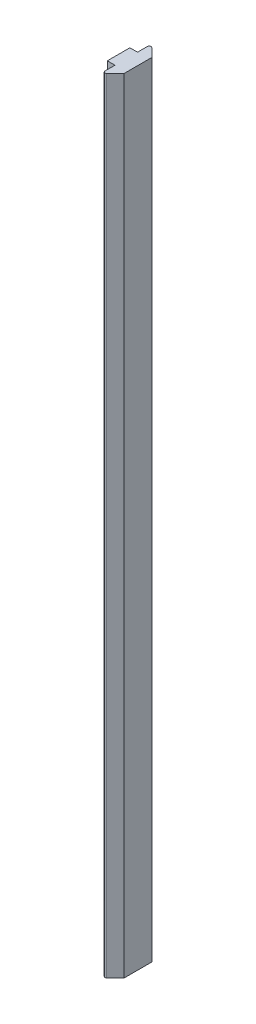
ISO-10303-21;
HEADER;
FILE_DESCRIPTION(('STEP AP214'),'2;1');
FILE_NAME('part.step','',(''),(''),'','','');
FILE_SCHEMA(('AUTOMOTIVE_DESIGN { 1 0 10303 214 1 1 1 1 }'));
ENDSEC;
DATA;
#1=APPLICATION_CONTEXT('core data for automotive mechanical design processes');
#2=APPLICATION_PROTOCOL_DEFINITION('international standard','automotive_design',2000,#1);
#3=PRODUCT_CONTEXT('',#1,'mechanical');
#4=PRODUCT('Part','Part','',(#3));
#5=PRODUCT_RELATED_PRODUCT_CATEGORY('part','',(#4));
#6=PRODUCT_DEFINITION_FORMATION('','',#4);
#7=PRODUCT_DEFINITION_CONTEXT('part definition',#1,'design');
#8=PRODUCT_DEFINITION('design','',#6,#7);
#9=PRODUCT_DEFINITION_SHAPE('','',#8);
#10=(LENGTH_UNIT() NAMED_UNIT(*) SI_UNIT(.MILLI.,.METRE.));
#11=(NAMED_UNIT(*) PLANE_ANGLE_UNIT() SI_UNIT($,.RADIAN.));
#12=(NAMED_UNIT(*) SI_UNIT($,.STERADIAN.) SOLID_ANGLE_UNIT());
#13=UNCERTAINTY_MEASURE_WITH_UNIT(LENGTH_MEASURE(1.E-05),#10,'distance_accuracy_value','');
#14=(GEOMETRIC_REPRESENTATION_CONTEXT(3) GLOBAL_UNCERTAINTY_ASSIGNED_CONTEXT((#13)) GLOBAL_UNIT_ASSIGNED_CONTEXT((#10,
#11,#12)) REPRESENTATION_CONTEXT('',''));
#15=CARTESIAN_POINT('',(0.,0.,0.));
#16=DIRECTION('',(0.,0.,1.));
#17=DIRECTION('',(1.,0.,0.));
#18=AXIS2_PLACEMENT_3D('',#15,#16,#17);
#19=CARTESIAN_POINT('',(-3.23933986621706,200.,2.87805090450655));
#20=DIRECTION('',(0.,0.,-1.));
#21=DIRECTION('',(-1.,0.,0.));
#22=AXIS2_PLACEMENT_3D('',#19,#20,#21);
#23=PLANE('',#22);
#24=DIRECTION('',(1.,0.,0.));
#25=VECTOR('',#24,1.);
#26=CARTESIAN_POINT('',(-3.23933986621706,0.,2.87805090450655));
#27=LINE('',#26,#25);
#28=CARTESIAN_POINT('',(-5.18933983831155,0.,2.87805090450655));
#29=VERTEX_POINT('',#28);
#30=CARTESIAN_POINT('',(-3.23933986621706,0.,2.87805090450655));
#31=VERTEX_POINT('',#30);
#32=EDGE_CURVE('E150',#29,#31,#27,.T.);
#33=ORIENTED_EDGE('',*,*,#32,.T.);
#34=DIRECTION('',(0.,-1.,0.));
#35=VECTOR('',#34,1.);
#36=CARTESIAN_POINT('',(-3.23933986621706,200.,2.87805090450655));
#37=LINE('',#36,#35);
#38=CARTESIAN_POINT('',(-3.23933986621706,200.,2.87805090450655));
#39=VERTEX_POINT('',#38);
#40=EDGE_CURVE('E11',#39,#31,#37,.T.);
#41=ORIENTED_EDGE('',*,*,#40,.F.);
#42=DIRECTION('',(1.,0.,0.));
#43=VECTOR('',#42,1.);
#44=CARTESIAN_POINT('',(-3.23933986621706,200.,2.87805090450655));
#45=LINE('',#44,#43);
#46=CARTESIAN_POINT('',(-5.18933983831155,200.,2.87805090450655));
#47=VERTEX_POINT('',#46);
#48=EDGE_CURVE('E164',#47,#39,#45,.T.);
#49=ORIENTED_EDGE('',*,*,#48,.F.);
#50=DIRECTION('',(0.,-1.,0.));
#51=VECTOR('',#50,1.);
#52=CARTESIAN_POINT('',(-5.18933983831155,200.,2.87805090450655));
#53=LINE('',#52,#51);
#54=EDGE_CURVE('E142',#47,#29,#53,.T.);
#55=ORIENTED_EDGE('',*,*,#54,.T.);
#56=EDGE_LOOP('',(#33,#41,#49,#55));
#57=FACE_BOUND('',#56,.T.);
#58=ADVANCED_FACE('F39',(#57),#23,.F.);
#59=CARTESIAN_POINT('',(-3.23933986621706,200.,2.87805090450655));
#60=DIRECTION('',(1.,0.,0.));
#61=DIRECTION('',(0.,0.,-1.));
#62=AXIS2_PLACEMENT_3D('',#59,#60,#61);
#63=PLANE('',#62);
#64=DIRECTION('',(0.,0.,1.));
#65=VECTOR('',#64,1.);
#66=CARTESIAN_POINT('',(-3.23933986621706,0.,2.87805090450655));
#67=LINE('',#66,#65);
#68=CARTESIAN_POINT('',(-3.23933986621706,0.,5.42744122113594));
#69=VERTEX_POINT('',#68);
#70=EDGE_CURVE('E148',#31,#69,#67,.T.);
#71=ORIENTED_EDGE('',*,*,#70,.T.);
#72=DIRECTION('',(0.,-1.,0.));
#73=VECTOR('',#72,1.);
#74=CARTESIAN_POINT('',(-3.23933986621706,200.,5.42744122113594));
#75=LINE('',#74,#73);
#76=CARTESIAN_POINT('',(-3.23933986621706,200.,5.42744122113594));
#77=VERTEX_POINT('',#76);
#78=EDGE_CURVE('E50',#77,#69,#75,.T.);
#79=ORIENTED_EDGE('',*,*,#78,.F.);
#80=DIRECTION('',(0.,0.,1.));
#81=VECTOR('',#80,1.);
#82=CARTESIAN_POINT('',(-3.23933986621706,200.,2.87805090450655));
#83=LINE('',#82,#81);
#84=EDGE_CURVE('E104',#39,#77,#83,.T.);
#85=ORIENTED_EDGE('',*,*,#84,.F.);
#86=ORIENTED_EDGE('',*,*,#40,.T.);
#87=EDGE_LOOP('',(#71,#79,#85,#86));
#88=FACE_BOUND('',#87,.T.);
#89=ADVANCED_FACE('F215',(#88),#63,.F.);
#90=CARTESIAN_POINT('',(-2.78933986621717,200.,5.42744122113487));
#91=DIRECTION('',(0.,-1.,0.));
#92=DIRECTION('',(0.,0.,-1.));
#93=AXIS2_PLACEMENT_3D('',#90,#91,#92);
#94=CYLINDRICAL_SURFACE('',#93,0.449999999999945);
#95=CARTESIAN_POINT('',(-2.78933986621717,0.,5.42744122113487));
#96=DIRECTION('',(0.,1.,0.));
#97=DIRECTION('',(0.,0.,1.));
#98=AXIS2_PLACEMENT_3D('',#95,#96,#97);
#99=CIRCLE('',#98,0.449999999999945);
#100=CARTESIAN_POINT('',(-2.47114181468326,0.,5.74563927266877));
#101=VERTEX_POINT('',#100);
#102=EDGE_CURVE('E155',#69,#101,#99,.T.);
#103=ORIENTED_EDGE('',*,*,#102,.T.);
#104=DIRECTION('',(0.,-1.,0.));
#105=VECTOR('',#104,1.);
#106=CARTESIAN_POINT('',(-2.47114181468326,200.,5.74563927266877));
#107=LINE('',#106,#105);
#108=CARTESIAN_POINT('',(-2.47114181468326,200.,5.74563927266877));
#109=VERTEX_POINT('',#108);
#110=EDGE_CURVE('E178',#109,#101,#107,.T.);
#111=ORIENTED_EDGE('',*,*,#110,.F.);
#112=CARTESIAN_POINT('',(-2.78933986621717,200.,5.42744122113487));
#113=DIRECTION('',(0.,1.,0.));
#114=DIRECTION('',(0.,0.,1.));
#115=AXIS2_PLACEMENT_3D('',#112,#113,#114);
#116=CIRCLE('',#115,0.449999999999945);
#117=EDGE_CURVE('E186',#77,#109,#116,.T.);
#118=ORIENTED_EDGE('',*,*,#117,.F.);
#119=ORIENTED_EDGE('',*,*,#78,.T.);
#120=EDGE_LOOP('',(#103,#111,#118,#119));
#121=FACE_BOUND('',#120,.T.);
#122=ADVANCED_FACE('F182',(#121),#94,.T.);
#123=CARTESIAN_POINT('',(-2.47114181468322,200.,5.74563927266882));
#124=DIRECTION('',(-0.707106781186552,0.,-0.707106781186544));
#125=DIRECTION('',(-0.707106781186544,0.,0.707106781186551));
#126=AXIS2_PLACEMENT_3D('',#123,#124,#125);
#127=PLANE('',#126);
#128=DIRECTION('',(0.707106781186544,0.,-0.707106781186551));
#129=VECTOR('',#128,1.);
#130=CARTESIAN_POINT('',(-2.47114181468322,0.,5.74563927266882));
#131=LINE('',#130,#129);
#132=CARTESIAN_POINT('',(-0.249999999999999,0.,3.52449745798557));
#133=VERTEX_POINT('',#132);
#134=EDGE_CURVE('E152',#101,#133,#131,.T.);
#135=ORIENTED_EDGE('',*,*,#134,.T.);
#136=DIRECTION('',(0.,-1.,0.));
#137=VECTOR('',#136,1.);
#138=CARTESIAN_POINT('',(-0.249999999999999,200.,3.52449745798557));
#139=LINE('',#138,#137);
#140=CARTESIAN_POINT('',(-0.249999999999999,200.,3.52449745798557));
#141=VERTEX_POINT('',#140);
#142=EDGE_CURVE('E172',#141,#133,#139,.T.);
#143=ORIENTED_EDGE('',*,*,#142,.F.);
#144=DIRECTION('',(0.707106781186544,0.,-0.707106781186551));
#145=VECTOR('',#144,1.);
#146=CARTESIAN_POINT('',(-2.47114181468322,200.,5.74563927266882));
#147=LINE('',#146,#145);
#148=EDGE_CURVE('E204',#109,#141,#147,.T.);
#149=ORIENTED_EDGE('',*,*,#148,.F.);
#150=ORIENTED_EDGE('',*,*,#110,.T.);
#151=EDGE_LOOP('',(#135,#143,#149,#150));
#152=FACE_BOUND('',#151,.T.);
#153=ADVANCED_FACE('F193',(#152),#127,.F.);
#154=CARTESIAN_POINT('',(-0.25,200.,-3.52449745798557));
#155=DIRECTION('',(-1.,0.,0.));
#156=DIRECTION('',(0.,0.,1.));
#157=AXIS2_PLACEMENT_3D('',#154,#155,#156);
#158=PLANE('',#157);
#159=DIRECTION('',(0.,0.,-1.));
#160=VECTOR('',#159,1.);
#161=CARTESIAN_POINT('',(-0.25,0.,-3.52449745798557));
#162=LINE('',#161,#160);
#163=CARTESIAN_POINT('',(-0.25,0.,-3.52449745798557));
#164=VERTEX_POINT('',#163);
#165=EDGE_CURVE('E157',#133,#164,#162,.T.);
#166=ORIENTED_EDGE('',*,*,#165,.T.);
#167=DIRECTION('',(0.,-1.,0.));
#168=VECTOR('',#167,1.);
#169=CARTESIAN_POINT('',(-0.25,200.,-3.52449745798557));
#170=LINE('',#169,#168);
#171=CARTESIAN_POINT('',(-0.25,200.,-3.52449745798557));
#172=VERTEX_POINT('',#171);
#173=EDGE_CURVE('E175',#172,#164,#170,.T.);
#174=ORIENTED_EDGE('',*,*,#173,.F.);
#175=DIRECTION('',(0.,0.,-1.));
#176=VECTOR('',#175,1.);
#177=CARTESIAN_POINT('',(-0.25,200.,-3.52449745798557));
#178=LINE('',#177,#176);
#179=EDGE_CURVE('E202',#141,#172,#178,.T.);
#180=ORIENTED_EDGE('',*,*,#179,.F.);
#181=ORIENTED_EDGE('',*,*,#142,.T.);
#182=EDGE_LOOP('',(#166,#174,#180,#181));
#183=FACE_BOUND('',#182,.T.);
#184=ADVANCED_FACE('F197',(#183),#158,.F.);
#185=CARTESIAN_POINT('',(-0.25,200.,-3.52449745798557));
#186=DIRECTION('',(-0.707106781186547,0.,0.707106781186548));
#187=DIRECTION('',(0.707106781186548,0.,0.707106781186547));
#188=AXIS2_PLACEMENT_3D('',#185,#186,#187);
#189=PLANE('',#188);
#190=DIRECTION('',(-0.707106781186548,0.,-0.707106781186547));
#191=VECTOR('',#190,1.);
#192=CARTESIAN_POINT('',(-0.25,0.,-3.52449745798557));
#193=LINE('',#192,#191);
#194=CARTESIAN_POINT('',(-2.47114181360244,0.,-5.74563927158801));
#195=VERTEX_POINT('',#194);
#196=EDGE_CURVE('E156',#164,#195,#193,.T.);
#197=ORIENTED_EDGE('',*,*,#196,.T.);
#198=DIRECTION('',(0.,-1.,0.));
#199=VECTOR('',#198,1.);
#200=CARTESIAN_POINT('',(-2.47114181360244,200.,-5.74563927158801));
#201=LINE('',#200,#199);
#202=CARTESIAN_POINT('',(-2.47114181360244,200.,-5.74563927158801));
#203=VERTEX_POINT('',#202);
#204=EDGE_CURVE('E170',#203,#195,#201,.T.);
#205=ORIENTED_EDGE('',*,*,#204,.F.);
#206=DIRECTION('',(-0.707106781186548,0.,-0.707106781186547));
#207=VECTOR('',#206,1.);
#208=CARTESIAN_POINT('',(-0.25,200.,-3.52449745798557));
#209=LINE('',#208,#207);
#210=EDGE_CURVE('E201',#172,#203,#209,.T.);
#211=ORIENTED_EDGE('',*,*,#210,.F.);
#212=ORIENTED_EDGE('',*,*,#173,.T.);
#213=EDGE_LOOP('',(#197,#205,#211,#212));
#214=FACE_BOUND('',#213,.T.);
#215=ADVANCED_FACE('F226',(#214),#189,.F.);
#216=CARTESIAN_POINT('',(-2.78933986469227,200.,-5.42744122049819));
#217=DIRECTION('',(0.,-1.,0.));
#218=DIRECTION('',(0.,0.,-1.));
#219=AXIS2_PLACEMENT_3D('',#216,#217,#218);
#220=CYLINDRICAL_SURFACE('',#219,0.449999999371916);
#221=CARTESIAN_POINT('',(-2.78933986469227,0.,-5.42744122049819));
#222=DIRECTION('',(0.,1.,0.));
#223=DIRECTION('',(0.,0.,1.));
#224=AXIS2_PLACEMENT_3D('',#221,#222,#223);
#225=CIRCLE('',#224,0.449999999371916);
#226=CARTESIAN_POINT('',(-3.23933986406418,0.,-5.42744122190511));
#227=VERTEX_POINT('',#226);
#228=EDGE_CURVE('E158',#195,#227,#225,.T.);
#229=ORIENTED_EDGE('',*,*,#228,.T.);
#230=DIRECTION('',(0.,-1.,0.));
#231=VECTOR('',#230,1.);
#232=CARTESIAN_POINT('',(-3.23933986406418,200.,-5.42744122190511));
#233=LINE('',#232,#231);
#234=CARTESIAN_POINT('',(-3.23933986406418,200.,-5.42744122190511));
#235=VERTEX_POINT('',#234);
#236=EDGE_CURVE('E138',#235,#227,#233,.T.);
#237=ORIENTED_EDGE('',*,*,#236,.F.);
#238=CARTESIAN_POINT('',(-2.78933986469227,200.,-5.42744122049819));
#239=DIRECTION('',(0.,1.,0.));
#240=DIRECTION('',(0.,0.,1.));
#241=AXIS2_PLACEMENT_3D('',#238,#239,#240);
#242=CIRCLE('',#241,0.449999999371916);
#243=EDGE_CURVE('E126',#203,#235,#242,.T.);
#244=ORIENTED_EDGE('',*,*,#243,.F.);
#245=ORIENTED_EDGE('',*,*,#204,.T.);
#246=EDGE_LOOP('',(#229,#237,#244,#245));
#247=FACE_BOUND('',#246,.T.);
#248=ADVANCED_FACE('F227',(#247),#220,.T.);
#249=CARTESIAN_POINT('',(-3.23933986406418,200.,-5.42744122190511));
#250=DIRECTION('',(1.,0.,0.));
#251=DIRECTION('',(0.,0.,-1.));
#252=AXIS2_PLACEMENT_3D('',#249,#250,#251);
#253=PLANE('',#252);
#254=DIRECTION('',(0.,0.,1.));
#255=VECTOR('',#254,1.);
#256=CARTESIAN_POINT('',(-3.23933986406418,0.,-5.42744122190511));
#257=LINE('',#256,#255);
#258=CARTESIAN_POINT('',(-3.23933986406424,0.,-2.87805084858101));
#259=VERTEX_POINT('',#258);
#260=EDGE_CURVE('E140',#227,#259,#257,.T.);
#261=ORIENTED_EDGE('',*,*,#260,.T.);
#262=DIRECTION('',(0.,-1.,0.));
#263=VECTOR('',#262,1.);
#264=CARTESIAN_POINT('',(-3.23933986406424,200.,-2.87805084858101));
#265=LINE('',#264,#263);
#266=CARTESIAN_POINT('',(-3.23933986406424,200.,-2.87805084858101));
#267=VERTEX_POINT('',#266);
#268=EDGE_CURVE('E132',#267,#259,#265,.T.);
#269=ORIENTED_EDGE('',*,*,#268,.F.);
#270=DIRECTION('',(0.,0.,1.));
#271=VECTOR('',#270,1.);
#272=CARTESIAN_POINT('',(-3.23933986406418,200.,-5.42744122190511));
#273=LINE('',#272,#271);
#274=EDGE_CURVE('E122',#235,#267,#273,.T.);
#275=ORIENTED_EDGE('',*,*,#274,.F.);
#276=ORIENTED_EDGE('',*,*,#236,.T.);
#277=EDGE_LOOP('',(#261,#269,#275,#276));
#278=FACE_BOUND('',#277,.T.);
#279=ADVANCED_FACE('F134',(#278),#253,.F.);
#280=CARTESIAN_POINT('',(-4.93933983831159,200.,-2.87805084858101));
#281=DIRECTION('',(0.,0.,1.));
#282=DIRECTION('',(1.,0.,0.));
#283=AXIS2_PLACEMENT_3D('',#280,#281,#282);
#284=PLANE('',#283);
#285=DIRECTION('',(-1.,0.,0.));
#286=VECTOR('',#285,1.);
#287=CARTESIAN_POINT('',(-4.93933983831159,0.,-2.87805084858101));
#288=LINE('',#287,#286);
#289=CARTESIAN_POINT('',(-5.18933983831155,0.,-2.87805084858101));
#290=VERTEX_POINT('',#289);
#291=EDGE_CURVE('E87',#259,#290,#288,.T.);
#292=ORIENTED_EDGE('',*,*,#291,.T.);
#293=DIRECTION('',(0.,-1.,0.));
#294=VECTOR('',#293,1.);
#295=CARTESIAN_POINT('',(-5.18933983831155,200.,-2.87805084858101));
#296=LINE('',#295,#294);
#297=CARTESIAN_POINT('',(-5.18933983831155,200.,-2.87805084858101));
#298=VERTEX_POINT('',#297);
#299=EDGE_CURVE('E137',#298,#290,#296,.T.);
#300=ORIENTED_EDGE('',*,*,#299,.F.);
#301=DIRECTION('',(-1.,0.,0.));
#302=VECTOR('',#301,1.);
#303=CARTESIAN_POINT('',(-3.23933986406424,200.,-2.87805084858101));
#304=LINE('',#303,#302);
#305=EDGE_CURVE('E128',#267,#298,#304,.T.);
#306=ORIENTED_EDGE('',*,*,#305,.F.);
#307=ORIENTED_EDGE('',*,*,#268,.T.);
#308=EDGE_LOOP('',(#292,#300,#306,#307));
#309=FACE_BOUND('',#308,.T.);
#310=ADVANCED_FACE('F141',(#309),#284,.F.);
#311=CARTESIAN_POINT('',(-5.18933983831155,200.,-2.87805084858101));
#312=DIRECTION('',(1.,0.,0.));
#313=DIRECTION('',(0.,0.,-1.));
#314=AXIS2_PLACEMENT_3D('',#311,#312,#313);
#315=PLANE('',#314);
#316=DIRECTION('',(0.,0.,1.));
#317=VECTOR('',#316,1.);
#318=CARTESIAN_POINT('',(-5.18933983831155,0.,-2.87805084858101));
#319=LINE('',#318,#317);
#320=EDGE_CURVE('E94',#290,#29,#319,.T.);
#321=ORIENTED_EDGE('',*,*,#320,.T.);
#322=ORIENTED_EDGE('',*,*,#54,.F.);
#323=DIRECTION('',(0.,0.,1.));
#324=VECTOR('',#323,1.);
#325=CARTESIAN_POINT('',(-5.18933983831155,200.,-2.87805084858101));
#326=LINE('',#325,#324);
#327=EDGE_CURVE('E54',#298,#47,#326,.T.);
#328=ORIENTED_EDGE('',*,*,#327,.F.);
#329=ORIENTED_EDGE('',*,*,#299,.T.);
#330=EDGE_LOOP('',(#321,#322,#328,#329));
#331=FACE_BOUND('',#330,.T.);
#332=ADVANCED_FACE('F239',(#331),#315,.F.);
#333=CARTESIAN_POINT('',(-2.78933986469227,200.,-5.42744122049819));
#334=DIRECTION('',(0.,1.,0.));
#335=DIRECTION('',(0.,0.,1.));
#336=AXIS2_PLACEMENT_3D('',#333,#334,#335);
#337=PLANE('',#336);
#338=ORIENTED_EDGE('',*,*,#48,.T.);
#339=ORIENTED_EDGE('',*,*,#84,.T.);
#340=ORIENTED_EDGE('',*,*,#117,.T.);
#341=ORIENTED_EDGE('',*,*,#148,.T.);
#342=ORIENTED_EDGE('',*,*,#179,.T.);
#343=ORIENTED_EDGE('',*,*,#210,.T.);
#344=ORIENTED_EDGE('',*,*,#243,.T.);
#345=ORIENTED_EDGE('',*,*,#274,.T.);
#346=ORIENTED_EDGE('',*,*,#305,.T.);
#347=ORIENTED_EDGE('',*,*,#327,.T.);
#348=EDGE_LOOP('',(#338,#339,#340,#341,#342,#343,#344,#345,#346,#347));
#349=FACE_BOUND('',#348,.T.);
#350=ADVANCED_FACE('F125',(#349),#337,.T.);
#351=CARTESIAN_POINT('',(-2.78933986469227,0.,-5.42744122049819));
#352=DIRECTION('',(0.,1.,0.));
#353=DIRECTION('',(0.,0.,1.));
#354=AXIS2_PLACEMENT_3D('',#351,#352,#353);
#355=PLANE('',#354);
#356=ORIENTED_EDGE('',*,*,#32,.F.);
#357=ORIENTED_EDGE('',*,*,#320,.F.);
#358=ORIENTED_EDGE('',*,*,#291,.F.);
#359=ORIENTED_EDGE('',*,*,#260,.F.);
#360=ORIENTED_EDGE('',*,*,#228,.F.);
#361=ORIENTED_EDGE('',*,*,#196,.F.);
#362=ORIENTED_EDGE('',*,*,#165,.F.);
#363=ORIENTED_EDGE('',*,*,#134,.F.);
#364=ORIENTED_EDGE('',*,*,#102,.F.);
#365=ORIENTED_EDGE('',*,*,#70,.F.);
#366=EDGE_LOOP('',(#356,#357,#358,#359,#360,#361,#362,#363,#364,#365));
#367=FACE_BOUND('',#366,.T.);
#368=ADVANCED_FACE('F189',(#367),#355,.F.);
#369=CLOSED_SHELL('',(#58,#89,#122,#153,#184,#215,#248,#279,#310,#332,#350,#368));
#370=MANIFOLD_SOLID_BREP('B2',#369);
#371=ADVANCED_BREP_SHAPE_REPRESENTATION('',(#18,#370),#14);
#372=SHAPE_DEFINITION_REPRESENTATION(#9,#371);
ENDSEC;
END-ISO-10303-21;
